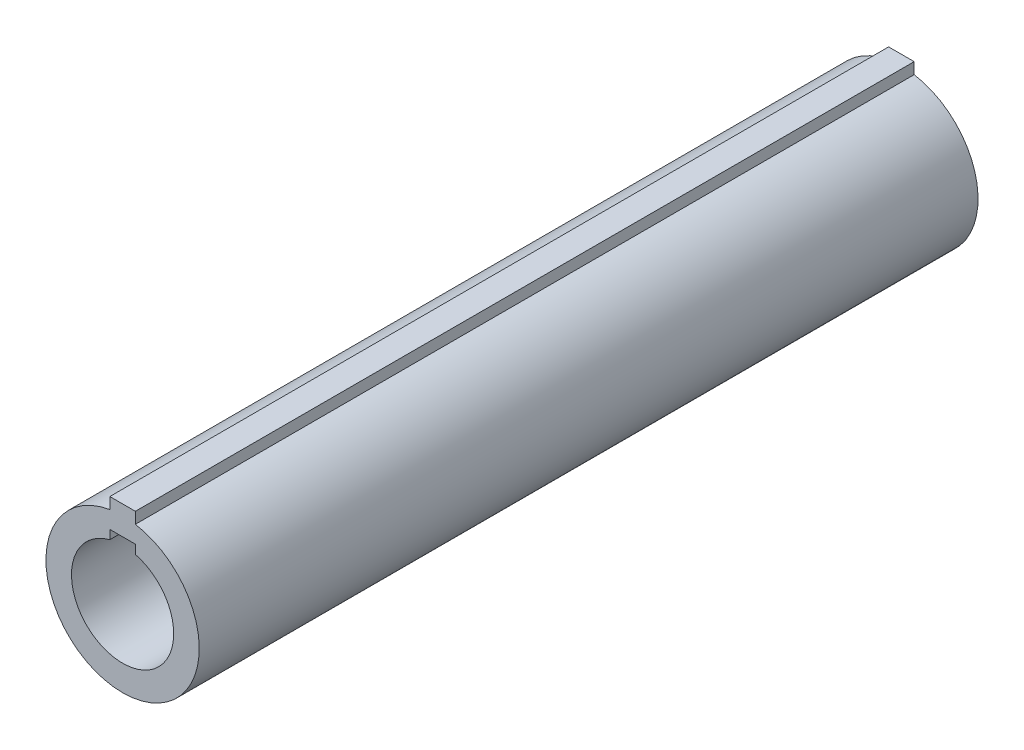
ISO-10303-21;
HEADER;
FILE_DESCRIPTION(('STEP AP214'),'2;1');
FILE_NAME('part.step','',(''),(''),'','','');
FILE_SCHEMA(('AUTOMOTIVE_DESIGN { 1 0 10303 214 1 1 1 1 }'));
ENDSEC;
DATA;
#1=APPLICATION_CONTEXT('core data for automotive mechanical design processes');
#2=APPLICATION_PROTOCOL_DEFINITION('international standard','automotive_design',2000,#1);
#3=PRODUCT_CONTEXT('',#1,'mechanical');
#4=PRODUCT('Part','Part','',(#3));
#5=PRODUCT_RELATED_PRODUCT_CATEGORY('part','',(#4));
#6=PRODUCT_DEFINITION_FORMATION('','',#4);
#7=PRODUCT_DEFINITION_CONTEXT('part definition',#1,'design');
#8=PRODUCT_DEFINITION('design','',#6,#7);
#9=PRODUCT_DEFINITION_SHAPE('','',#8);
#10=(LENGTH_UNIT() NAMED_UNIT(*) SI_UNIT(.MILLI.,.METRE.));
#11=(NAMED_UNIT(*) PLANE_ANGLE_UNIT() SI_UNIT($,.RADIAN.));
#12=(NAMED_UNIT(*) SI_UNIT($,.STERADIAN.) SOLID_ANGLE_UNIT());
#13=UNCERTAINTY_MEASURE_WITH_UNIT(LENGTH_MEASURE(1.E-05),#10,'distance_accuracy_value','');
#14=(GEOMETRIC_REPRESENTATION_CONTEXT(3) GLOBAL_UNCERTAINTY_ASSIGNED_CONTEXT((#13)) GLOBAL_UNIT_ASSIGNED_CONTEXT((#10,
#11,#12)) REPRESENTATION_CONTEXT('',''));
#15=CARTESIAN_POINT('',(0.,0.,0.));
#16=DIRECTION('',(0.,0.,1.));
#17=DIRECTION('',(1.,0.,0.));
#18=AXIS2_PLACEMENT_3D('',#15,#16,#17);
#19=CARTESIAN_POINT('',(-2.5,14.790199457749,152.4));
#20=DIRECTION('',(-1.,0.,0.));
#21=DIRECTION('',(0.,0.,1.));
#22=AXIS2_PLACEMENT_3D('',#19,#20,#21);
#23=PLANE('',#22);
#24=DIRECTION('',(0.,1.,0.));
#25=VECTOR('',#24,1.);
#26=CARTESIAN_POINT('',(-2.5,14.790199457749,0.));
#27=LINE('',#26,#25);
#28=CARTESIAN_POINT('',(-2.5,14.790199457749,0.));
#29=VERTEX_POINT('',#28);
#30=CARTESIAN_POINT('',(-2.5,17.,0.));
#31=VERTEX_POINT('',#30);
#32=EDGE_CURVE('E164',#29,#31,#27,.T.);
#33=ORIENTED_EDGE('',*,*,#32,.F.);
#34=DIRECTION('',(0.,0.,-1.));
#35=VECTOR('',#34,1.);
#36=CARTESIAN_POINT('',(-2.5,14.790199457749,152.4));
#37=LINE('',#36,#35);
#38=CARTESIAN_POINT('',(-2.5,14.790199457749,152.4));
#39=VERTEX_POINT('',#38);
#40=EDGE_CURVE('E12',#39,#29,#37,.T.);
#41=ORIENTED_EDGE('',*,*,#40,.F.);
#42=DIRECTION('',(0.,1.,0.));
#43=VECTOR('',#42,1.);
#44=CARTESIAN_POINT('',(-2.5,14.790199457749,152.4));
#45=LINE('',#44,#43);
#46=CARTESIAN_POINT('',(-2.5,17.,152.4));
#47=VERTEX_POINT('',#46);
#48=EDGE_CURVE('E168',#39,#47,#45,.T.);
#49=ORIENTED_EDGE('',*,*,#48,.T.);
#50=DIRECTION('',(0.,0.,-1.));
#51=VECTOR('',#50,1.);
#52=CARTESIAN_POINT('',(-2.5,17.,152.4));
#53=LINE('',#52,#51);
#54=EDGE_CURVE('E69',#47,#31,#53,.T.);
#55=ORIENTED_EDGE('',*,*,#54,.T.);
#56=EDGE_LOOP('',(#33,#41,#49,#55));
#57=FACE_BOUND('',#56,.T.);
#58=ADVANCED_FACE('F66',(#57),#23,.T.);
#59=CARTESIAN_POINT('',(0.,0.,152.4));
#60=DIRECTION('',(0.,0.,-1.));
#61=DIRECTION('',(-1.,0.,0.));
#62=AXIS2_PLACEMENT_3D('',#59,#60,#61);
#63=CYLINDRICAL_SURFACE('',#62,15.);
#64=CARTESIAN_POINT('',(0.,0.,0.));
#65=DIRECTION('',(0.,0.,1.));
#66=DIRECTION('',(1.,0.,0.));
#67=AXIS2_PLACEMENT_3D('',#64,#65,#66);
#68=CIRCLE('',#67,15.);
#69=CARTESIAN_POINT('',(2.49999999999999,14.790199457749,0.));
#70=VERTEX_POINT('',#69);
#71=EDGE_CURVE('E172',#29,#70,#68,.T.);
#72=ORIENTED_EDGE('',*,*,#71,.T.);
#73=DIRECTION('',(0.,0.,-1.));
#74=VECTOR('',#73,1.);
#75=CARTESIAN_POINT('',(2.49999999999999,14.790199457749,152.4));
#76=LINE('',#75,#74);
#77=CARTESIAN_POINT('',(2.49999999999999,14.790199457749,152.4));
#78=VERTEX_POINT('',#77);
#79=EDGE_CURVE('E74',#78,#70,#76,.T.);
#80=ORIENTED_EDGE('',*,*,#79,.F.);
#81=CARTESIAN_POINT('',(0.,0.,152.4));
#82=DIRECTION('',(0.,0.,1.));
#83=DIRECTION('',(1.,0.,0.));
#84=AXIS2_PLACEMENT_3D('',#81,#82,#83);
#85=CIRCLE('',#84,15.);
#86=EDGE_CURVE('E178',#39,#78,#85,.T.);
#87=ORIENTED_EDGE('',*,*,#86,.F.);
#88=ORIENTED_EDGE('',*,*,#40,.T.);
#89=EDGE_LOOP('',(#72,#80,#87,#88));
#90=FACE_BOUND('',#89,.T.);
#91=ADVANCED_FACE('F204',(#90),#63,.T.);
#92=CARTESIAN_POINT('',(2.5,17.,152.4));
#93=DIRECTION('',(1.,0.,0.));
#94=DIRECTION('',(0.,0.,-1.));
#95=AXIS2_PLACEMENT_3D('',#92,#93,#94);
#96=PLANE('',#95);
#97=DIRECTION('',(0.,-1.,0.));
#98=VECTOR('',#97,1.);
#99=CARTESIAN_POINT('',(2.5,17.,0.));
#100=LINE('',#99,#98);
#101=CARTESIAN_POINT('',(2.5,17.,0.));
#102=VERTEX_POINT('',#101);
#103=EDGE_CURVE('E185',#102,#70,#100,.T.);
#104=ORIENTED_EDGE('',*,*,#103,.F.);
#105=DIRECTION('',(0.,0.,-1.));
#106=VECTOR('',#105,1.);
#107=CARTESIAN_POINT('',(2.5,17.,152.4));
#108=LINE('',#107,#106);
#109=CARTESIAN_POINT('',(2.5,17.,152.4));
#110=VERTEX_POINT('',#109);
#111=EDGE_CURVE('E190',#110,#102,#108,.T.);
#112=ORIENTED_EDGE('',*,*,#111,.F.);
#113=DIRECTION('',(0.,-1.,0.));
#114=VECTOR('',#113,1.);
#115=CARTESIAN_POINT('',(2.5,17.,152.4));
#116=LINE('',#115,#114);
#117=EDGE_CURVE('E175',#110,#78,#116,.T.);
#118=ORIENTED_EDGE('',*,*,#117,.T.);
#119=ORIENTED_EDGE('',*,*,#79,.T.);
#120=EDGE_LOOP('',(#104,#112,#118,#119));
#121=FACE_BOUND('',#120,.T.);
#122=ADVANCED_FACE('F208',(#121),#96,.T.);
#123=CARTESIAN_POINT('',(-2.5,17.,152.4));
#124=DIRECTION('',(0.,1.,0.));
#125=DIRECTION('',(0.,0.,1.));
#126=AXIS2_PLACEMENT_3D('',#123,#124,#125);
#127=PLANE('',#126);
#128=DIRECTION('',(1.,0.,0.));
#129=VECTOR('',#128,1.);
#130=CARTESIAN_POINT('',(-2.5,17.,0.));
#131=LINE('',#130,#129);
#132=EDGE_CURVE('E182',#31,#102,#131,.T.);
#133=ORIENTED_EDGE('',*,*,#132,.F.);
#134=ORIENTED_EDGE('',*,*,#54,.F.);
#135=DIRECTION('',(1.,0.,0.));
#136=VECTOR('',#135,1.);
#137=CARTESIAN_POINT('',(-2.5,17.,152.4));
#138=LINE('',#137,#136);
#139=EDGE_CURVE('E171',#47,#110,#138,.T.);
#140=ORIENTED_EDGE('',*,*,#139,.T.);
#141=ORIENTED_EDGE('',*,*,#111,.T.);
#142=EDGE_LOOP('',(#133,#134,#140,#141));
#143=FACE_BOUND('',#142,.T.);
#144=ADVANCED_FACE('F198',(#143),#127,.T.);
#145=CARTESIAN_POINT('',(0.,0.,152.4));
#146=DIRECTION('',(0.,0.,1.));
#147=DIRECTION('',(1.,0.,0.));
#148=AXIS2_PLACEMENT_3D('',#145,#146,#147);
#149=PLANE('',#148);
#150=DIRECTION('',(0.,1.,0.));
#151=VECTOR('',#150,1.);
#152=CARTESIAN_POINT('',(-2.5,9.68245836551854,152.4));
#153=LINE('',#152,#151);
#154=CARTESIAN_POINT('',(-2.5,9.68245836551854,152.4));
#155=VERTEX_POINT('',#154);
#156=CARTESIAN_POINT('',(-2.5,11.43,152.4));
#157=VERTEX_POINT('',#156);
#158=EDGE_CURVE('E134',#155,#157,#153,.T.);
#159=ORIENTED_EDGE('',*,*,#158,.T.);
#160=DIRECTION('',(1.,0.,0.));
#161=VECTOR('',#160,1.);
#162=CARTESIAN_POINT('',(-2.5,11.43,152.4));
#163=LINE('',#162,#161);
#164=CARTESIAN_POINT('',(2.5,11.43,152.4));
#165=VERTEX_POINT('',#164);
#166=EDGE_CURVE('E143',#157,#165,#163,.T.);
#167=ORIENTED_EDGE('',*,*,#166,.T.);
#168=DIRECTION('',(0.,-1.,0.));
#169=VECTOR('',#168,1.);
#170=CARTESIAN_POINT('',(2.5,11.43,152.4));
#171=LINE('',#170,#169);
#172=CARTESIAN_POINT('',(2.5,9.68245836551854,152.4));
#173=VERTEX_POINT('',#172);
#174=EDGE_CURVE('E82',#165,#173,#171,.T.);
#175=ORIENTED_EDGE('',*,*,#174,.T.);
#176=CARTESIAN_POINT('',(0.,0.,152.4));
#177=DIRECTION('',(0.,0.,1.));
#178=DIRECTION('',(1.,0.,0.));
#179=AXIS2_PLACEMENT_3D('',#176,#177,#178);
#180=CIRCLE('',#179,10.);
#181=EDGE_CURVE('E140',#155,#173,#180,.T.);
#182=ORIENTED_EDGE('',*,*,#181,.F.);
#183=EDGE_LOOP('',(#159,#167,#175,#182));
#184=FACE_BOUND('',#183,.T.);
#185=ORIENTED_EDGE('',*,*,#48,.F.);
#186=ORIENTED_EDGE('',*,*,#86,.T.);
#187=ORIENTED_EDGE('',*,*,#117,.F.);
#188=ORIENTED_EDGE('',*,*,#139,.F.);
#189=EDGE_LOOP('',(#185,#186,#187,#188));
#190=FACE_BOUND('',#189,.T.);
#191=ADVANCED_FACE('F147',(#184,#190),#149,.T.);
#192=CARTESIAN_POINT('',(0.,0.,0.));
#193=DIRECTION('',(0.,0.,1.));
#194=DIRECTION('',(1.,0.,0.));
#195=AXIS2_PLACEMENT_3D('',#192,#193,#194);
#196=PLANE('',#195);
#197=DIRECTION('',(1.,0.,0.));
#198=VECTOR('',#197,1.);
#199=CARTESIAN_POINT('',(-2.5,11.43,0.));
#200=LINE('',#199,#198);
#201=CARTESIAN_POINT('',(-2.5,11.43,0.));
#202=VERTEX_POINT('',#201);
#203=CARTESIAN_POINT('',(2.5,11.43,0.));
#204=VERTEX_POINT('',#203);
#205=EDGE_CURVE('E158',#202,#204,#200,.T.);
#206=ORIENTED_EDGE('',*,*,#205,.F.);
#207=DIRECTION('',(0.,1.,0.));
#208=VECTOR('',#207,1.);
#209=CARTESIAN_POINT('',(-2.5,9.68245836551854,0.));
#210=LINE('',#209,#208);
#211=CARTESIAN_POINT('',(-2.5,9.68245836551854,0.));
#212=VERTEX_POINT('',#211);
#213=EDGE_CURVE('E90',#212,#202,#210,.T.);
#214=ORIENTED_EDGE('',*,*,#213,.F.);
#215=CARTESIAN_POINT('',(0.,0.,0.));
#216=DIRECTION('',(0.,0.,1.));
#217=DIRECTION('',(1.,0.,0.));
#218=AXIS2_PLACEMENT_3D('',#215,#216,#217);
#219=CIRCLE('',#218,10.);
#220=CARTESIAN_POINT('',(2.5,9.68245836551854,0.));
#221=VERTEX_POINT('',#220);
#222=EDGE_CURVE('E149',#212,#221,#219,.T.);
#223=ORIENTED_EDGE('',*,*,#222,.T.);
#224=DIRECTION('',(0.,-1.,0.));
#225=VECTOR('',#224,1.);
#226=CARTESIAN_POINT('',(2.5,11.43,0.));
#227=LINE('',#226,#225);
#228=EDGE_CURVE('E152',#204,#221,#227,.T.);
#229=ORIENTED_EDGE('',*,*,#228,.F.);
#230=EDGE_LOOP('',(#206,#214,#223,#229));
#231=FACE_BOUND('',#230,.T.);
#232=ORIENTED_EDGE('',*,*,#32,.T.);
#233=ORIENTED_EDGE('',*,*,#132,.T.);
#234=ORIENTED_EDGE('',*,*,#103,.T.);
#235=ORIENTED_EDGE('',*,*,#71,.F.);
#236=EDGE_LOOP('',(#232,#233,#234,#235));
#237=FACE_BOUND('',#236,.T.);
#238=ADVANCED_FACE('F201',(#231,#237),#196,.F.);
#239=CARTESIAN_POINT('',(-2.5,9.68245836551854,152.4));
#240=DIRECTION('',(-1.,0.,0.));
#241=DIRECTION('',(0.,-1.,0.));
#242=AXIS2_PLACEMENT_3D('',#239,#240,#241);
#243=PLANE('',#242);
#244=ORIENTED_EDGE('',*,*,#213,.T.);
#245=DIRECTION('',(0.,0.,-1.));
#246=VECTOR('',#245,1.);
#247=CARTESIAN_POINT('',(-2.5,11.43,152.4));
#248=LINE('',#247,#246);
#249=EDGE_CURVE('E130',#157,#202,#248,.T.);
#250=ORIENTED_EDGE('',*,*,#249,.F.);
#251=ORIENTED_EDGE('',*,*,#158,.F.);
#252=DIRECTION('',(0.,0.,-1.));
#253=VECTOR('',#252,1.);
#254=CARTESIAN_POINT('',(-2.5,9.68245836551854,152.4));
#255=LINE('',#254,#253);
#256=EDGE_CURVE('E162',#155,#212,#255,.T.);
#257=ORIENTED_EDGE('',*,*,#256,.T.);
#258=EDGE_LOOP('',(#244,#250,#251,#257));
#259=FACE_BOUND('',#258,.T.);
#260=ADVANCED_FACE('F132',(#259),#243,.F.);
#261=CARTESIAN_POINT('',(0.,0.,152.4));
#262=DIRECTION('',(0.,0.,-1.));
#263=DIRECTION('',(-1.,0.,0.));
#264=AXIS2_PLACEMENT_3D('',#261,#262,#263);
#265=CYLINDRICAL_SURFACE('',#264,10.);
#266=ORIENTED_EDGE('',*,*,#222,.F.);
#267=ORIENTED_EDGE('',*,*,#256,.F.);
#268=ORIENTED_EDGE('',*,*,#181,.T.);
#269=DIRECTION('',(0.,0.,-1.));
#270=VECTOR('',#269,1.);
#271=CARTESIAN_POINT('',(2.5,9.68245836551854,152.4));
#272=LINE('',#271,#270);
#273=EDGE_CURVE('E165',#173,#221,#272,.T.);
#274=ORIENTED_EDGE('',*,*,#273,.T.);
#275=EDGE_LOOP('',(#266,#267,#268,#274));
#276=FACE_BOUND('',#275,.T.);
#277=ADVANCED_FACE('F261',(#276),#265,.F.);
#278=CARTESIAN_POINT('',(2.5,11.43,152.4));
#279=DIRECTION('',(1.,0.,0.));
#280=DIRECTION('',(0.,1.,0.));
#281=AXIS2_PLACEMENT_3D('',#278,#279,#280);
#282=PLANE('',#281);
#283=ORIENTED_EDGE('',*,*,#228,.T.);
#284=ORIENTED_EDGE('',*,*,#273,.F.);
#285=ORIENTED_EDGE('',*,*,#174,.F.);
#286=DIRECTION('',(0.,0.,-1.));
#287=VECTOR('',#286,1.);
#288=CARTESIAN_POINT('',(2.5,11.43,152.4));
#289=LINE('',#288,#287);
#290=EDGE_CURVE('E139',#165,#204,#289,.T.);
#291=ORIENTED_EDGE('',*,*,#290,.T.);
#292=EDGE_LOOP('',(#283,#284,#285,#291));
#293=FACE_BOUND('',#292,.T.);
#294=ADVANCED_FACE('F270',(#293),#282,.F.);
#295=CARTESIAN_POINT('',(-2.5,11.43,152.4));
#296=DIRECTION('',(0.,1.,0.));
#297=DIRECTION('',(0.,0.,1.));
#298=AXIS2_PLACEMENT_3D('',#295,#296,#297);
#299=PLANE('',#298);
#300=ORIENTED_EDGE('',*,*,#205,.T.);
#301=ORIENTED_EDGE('',*,*,#290,.F.);
#302=ORIENTED_EDGE('',*,*,#166,.F.);
#303=ORIENTED_EDGE('',*,*,#249,.T.);
#304=EDGE_LOOP('',(#300,#301,#302,#303));
#305=FACE_BOUND('',#304,.T.);
#306=ADVANCED_FACE('F144',(#305),#299,.F.);
#307=CLOSED_SHELL('',(#58,#91,#122,#144,#191,#238,#260,#277,#294,#306));
#308=MANIFOLD_SOLID_BREP('B2',#307);
#309=ADVANCED_BREP_SHAPE_REPRESENTATION('',(#18,#308),#14);
#310=SHAPE_DEFINITION_REPRESENTATION(#9,#309);
ENDSEC;
END-ISO-10303-21;
